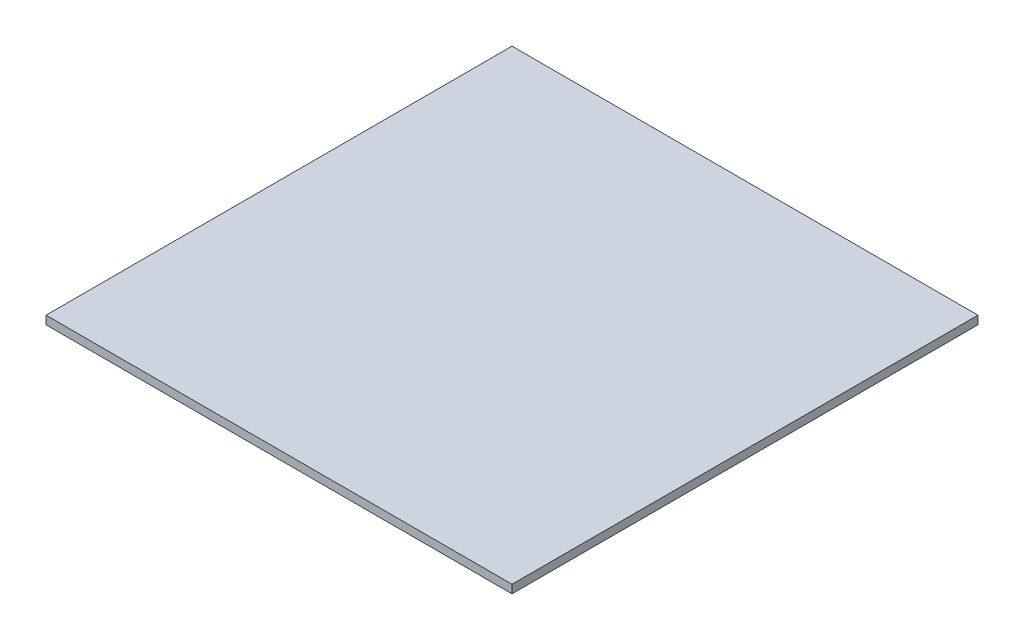
ISO-10303-21;
HEADER;
FILE_DESCRIPTION(('STEP AP214'),'2;1');
FILE_NAME('part.step','',(''),(''),'','','');
FILE_SCHEMA(('AUTOMOTIVE_DESIGN { 1 0 10303 214 1 1 1 1 }'));
ENDSEC;
DATA;
#1=APPLICATION_CONTEXT('core data for automotive mechanical design processes');
#2=APPLICATION_PROTOCOL_DEFINITION('international standard','automotive_design',2000,#1);
#3=PRODUCT_CONTEXT('',#1,'mechanical');
#4=PRODUCT('Part','Part','',(#3));
#5=PRODUCT_RELATED_PRODUCT_CATEGORY('part','',(#4));
#6=PRODUCT_DEFINITION_FORMATION('','',#4);
#7=PRODUCT_DEFINITION_CONTEXT('part definition',#1,'design');
#8=PRODUCT_DEFINITION('design','',#6,#7);
#9=PRODUCT_DEFINITION_SHAPE('','',#8);
#10=(LENGTH_UNIT() NAMED_UNIT(*) SI_UNIT(.MILLI.,.METRE.));
#11=(NAMED_UNIT(*) PLANE_ANGLE_UNIT() SI_UNIT($,.RADIAN.));
#12=(NAMED_UNIT(*) SI_UNIT($,.STERADIAN.) SOLID_ANGLE_UNIT());
#13=UNCERTAINTY_MEASURE_WITH_UNIT(LENGTH_MEASURE(1.E-05),#10,'distance_accuracy_value','');
#14=(GEOMETRIC_REPRESENTATION_CONTEXT(3) GLOBAL_UNCERTAINTY_ASSIGNED_CONTEXT((#13)) GLOBAL_UNIT_ASSIGNED_CONTEXT((#10,
#11,#12)) REPRESENTATION_CONTEXT('',''));
#15=CARTESIAN_POINT('',(0.,0.,0.));
#16=DIRECTION('',(0.,0.,1.));
#17=DIRECTION('',(1.,0.,0.));
#18=AXIS2_PLACEMENT_3D('',#15,#16,#17);
#19=CARTESIAN_POINT('',(280.,10.,280.));
#20=DIRECTION('',(-1.,0.,0.));
#21=DIRECTION('',(0.,0.,1.));
#22=AXIS2_PLACEMENT_3D('',#19,#20,#21);
#23=PLANE('',#22);
#24=DIRECTION('',(0.,0.,-1.));
#25=VECTOR('',#24,1.);
#26=CARTESIAN_POINT('',(280.,0.,280.));
#27=LINE('',#26,#25);
#28=CARTESIAN_POINT('',(280.,0.,280.));
#29=VERTEX_POINT('',#28);
#30=CARTESIAN_POINT('',(280.,0.,-280.));
#31=VERTEX_POINT('',#30);
#32=EDGE_CURVE('E95',#29,#31,#27,.T.);
#33=ORIENTED_EDGE('',*,*,#32,.T.);
#34=DIRECTION('',(0.,-1.,0.));
#35=VECTOR('',#34,1.);
#36=CARTESIAN_POINT('',(280.,10.,-280.));
#37=LINE('',#36,#35);
#38=CARTESIAN_POINT('',(280.,10.,-280.));
#39=VERTEX_POINT('',#38);
#40=EDGE_CURVE('E11',#39,#31,#37,.T.);
#41=ORIENTED_EDGE('',*,*,#40,.F.);
#42=DIRECTION('',(0.,0.,-1.));
#43=VECTOR('',#42,1.);
#44=CARTESIAN_POINT('',(280.,10.,280.));
#45=LINE('',#44,#43);
#46=CARTESIAN_POINT('',(280.,10.,280.));
#47=VERTEX_POINT('',#46);
#48=EDGE_CURVE('E83',#47,#39,#45,.T.);
#49=ORIENTED_EDGE('',*,*,#48,.F.);
#50=DIRECTION('',(0.,-1.,0.));
#51=VECTOR('',#50,1.);
#52=CARTESIAN_POINT('',(280.,10.,280.));
#53=LINE('',#52,#51);
#54=EDGE_CURVE('E91',#47,#29,#53,.T.);
#55=ORIENTED_EDGE('',*,*,#54,.T.);
#56=EDGE_LOOP('',(#33,#41,#49,#55));
#57=FACE_BOUND('',#56,.T.);
#58=ADVANCED_FACE('F32',(#57),#23,.F.);
#59=CARTESIAN_POINT('',(-280.,10.,-280.));
#60=DIRECTION('',(0.,0.,1.));
#61=DIRECTION('',(1.,0.,0.));
#62=AXIS2_PLACEMENT_3D('',#59,#60,#61);
#63=PLANE('',#62);
#64=DIRECTION('',(-1.,0.,0.));
#65=VECTOR('',#64,1.);
#66=CARTESIAN_POINT('',(-280.,0.,-280.));
#67=LINE('',#66,#65);
#68=CARTESIAN_POINT('',(-280.,0.,-280.));
#69=VERTEX_POINT('',#68);
#70=EDGE_CURVE('E87',#31,#69,#67,.T.);
#71=ORIENTED_EDGE('',*,*,#70,.T.);
#72=DIRECTION('',(0.,-1.,0.));
#73=VECTOR('',#72,1.);
#74=CARTESIAN_POINT('',(-280.,10.,-280.));
#75=LINE('',#74,#73);
#76=CARTESIAN_POINT('',(-280.,10.,-280.));
#77=VERTEX_POINT('',#76);
#78=EDGE_CURVE('E40',#77,#69,#75,.T.);
#79=ORIENTED_EDGE('',*,*,#78,.F.);
#80=DIRECTION('',(-1.,0.,0.));
#81=VECTOR('',#80,1.);
#82=CARTESIAN_POINT('',(-280.,10.,-280.));
#83=LINE('',#82,#81);
#84=EDGE_CURVE('E78',#39,#77,#83,.T.);
#85=ORIENTED_EDGE('',*,*,#84,.F.);
#86=ORIENTED_EDGE('',*,*,#40,.T.);
#87=EDGE_LOOP('',(#71,#79,#85,#86));
#88=FACE_BOUND('',#87,.T.);
#89=ADVANCED_FACE('F86',(#88),#63,.F.);
#90=CARTESIAN_POINT('',(-280.,10.,280.));
#91=DIRECTION('',(1.,0.,0.));
#92=DIRECTION('',(0.,0.,-1.));
#93=AXIS2_PLACEMENT_3D('',#90,#91,#92);
#94=PLANE('',#93);
#95=DIRECTION('',(0.,0.,1.));
#96=VECTOR('',#95,1.);
#97=CARTESIAN_POINT('',(-280.,0.,280.));
#98=LINE('',#97,#96);
#99=CARTESIAN_POINT('',(-280.,0.,280.));
#100=VERTEX_POINT('',#99);
#101=EDGE_CURVE('E65',#69,#100,#98,.T.);
#102=ORIENTED_EDGE('',*,*,#101,.T.);
#103=DIRECTION('',(0.,-1.,0.));
#104=VECTOR('',#103,1.);
#105=CARTESIAN_POINT('',(-280.,10.,280.));
#106=LINE('',#105,#104);
#107=CARTESIAN_POINT('',(-280.,10.,280.));
#108=VERTEX_POINT('',#107);
#109=EDGE_CURVE('E88',#108,#100,#106,.T.);
#110=ORIENTED_EDGE('',*,*,#109,.F.);
#111=DIRECTION('',(0.,0.,1.));
#112=VECTOR('',#111,1.);
#113=CARTESIAN_POINT('',(-280.,10.,280.));
#114=LINE('',#113,#112);
#115=EDGE_CURVE('E81',#77,#108,#114,.T.);
#116=ORIENTED_EDGE('',*,*,#115,.F.);
#117=ORIENTED_EDGE('',*,*,#78,.T.);
#118=EDGE_LOOP('',(#102,#110,#116,#117));
#119=FACE_BOUND('',#118,.T.);
#120=ADVANCED_FACE('F89',(#119),#94,.F.);
#121=CARTESIAN_POINT('',(-280.,10.,280.));
#122=DIRECTION('',(0.,0.,-1.));
#123=DIRECTION('',(-1.,0.,0.));
#124=AXIS2_PLACEMENT_3D('',#121,#122,#123);
#125=PLANE('',#124);
#126=DIRECTION('',(1.,0.,0.));
#127=VECTOR('',#126,1.);
#128=CARTESIAN_POINT('',(-280.,0.,280.));
#129=LINE('',#128,#127);
#130=EDGE_CURVE('E71',#100,#29,#129,.T.);
#131=ORIENTED_EDGE('',*,*,#130,.T.);
#132=ORIENTED_EDGE('',*,*,#54,.F.);
#133=DIRECTION('',(1.,0.,0.));
#134=VECTOR('',#133,1.);
#135=CARTESIAN_POINT('',(-280.,10.,280.));
#136=LINE('',#135,#134);
#137=EDGE_CURVE('E48',#108,#47,#136,.T.);
#138=ORIENTED_EDGE('',*,*,#137,.F.);
#139=ORIENTED_EDGE('',*,*,#109,.T.);
#140=EDGE_LOOP('',(#131,#132,#138,#139));
#141=FACE_BOUND('',#140,.T.);
#142=ADVANCED_FACE('F102',(#141),#125,.F.);
#143=CARTESIAN_POINT('',(0.,10.,0.));
#144=DIRECTION('',(0.,-1.,0.));
#145=DIRECTION('',(0.,0.,-1.));
#146=AXIS2_PLACEMENT_3D('',#143,#144,#145);
#147=PLANE('',#146);
#148=ORIENTED_EDGE('',*,*,#48,.T.);
#149=ORIENTED_EDGE('',*,*,#84,.T.);
#150=ORIENTED_EDGE('',*,*,#115,.T.);
#151=ORIENTED_EDGE('',*,*,#137,.T.);
#152=EDGE_LOOP('',(#148,#149,#150,#151));
#153=FACE_BOUND('',#152,.T.);
#154=ADVANCED_FACE('F79',(#153),#147,.F.);
#155=CARTESIAN_POINT('',(0.,0.,0.));
#156=DIRECTION('',(0.,-1.,0.));
#157=DIRECTION('',(0.,0.,-1.));
#158=AXIS2_PLACEMENT_3D('',#155,#156,#157);
#159=PLANE('',#158);
#160=ORIENTED_EDGE('',*,*,#32,.F.);
#161=ORIENTED_EDGE('',*,*,#130,.F.);
#162=ORIENTED_EDGE('',*,*,#101,.F.);
#163=ORIENTED_EDGE('',*,*,#70,.F.);
#164=EDGE_LOOP('',(#160,#161,#162,#163));
#165=FACE_BOUND('',#164,.T.);
#166=ADVANCED_FACE('F105',(#165),#159,.T.);
#167=CLOSED_SHELL('',(#58,#89,#120,#142,#154,#166));
#168=MANIFOLD_SOLID_BREP('B2',#167);
#169=ADVANCED_BREP_SHAPE_REPRESENTATION('',(#18,#168),#14);
#170=SHAPE_DEFINITION_REPRESENTATION(#9,#169);
ENDSEC;
END-ISO-10303-21;
